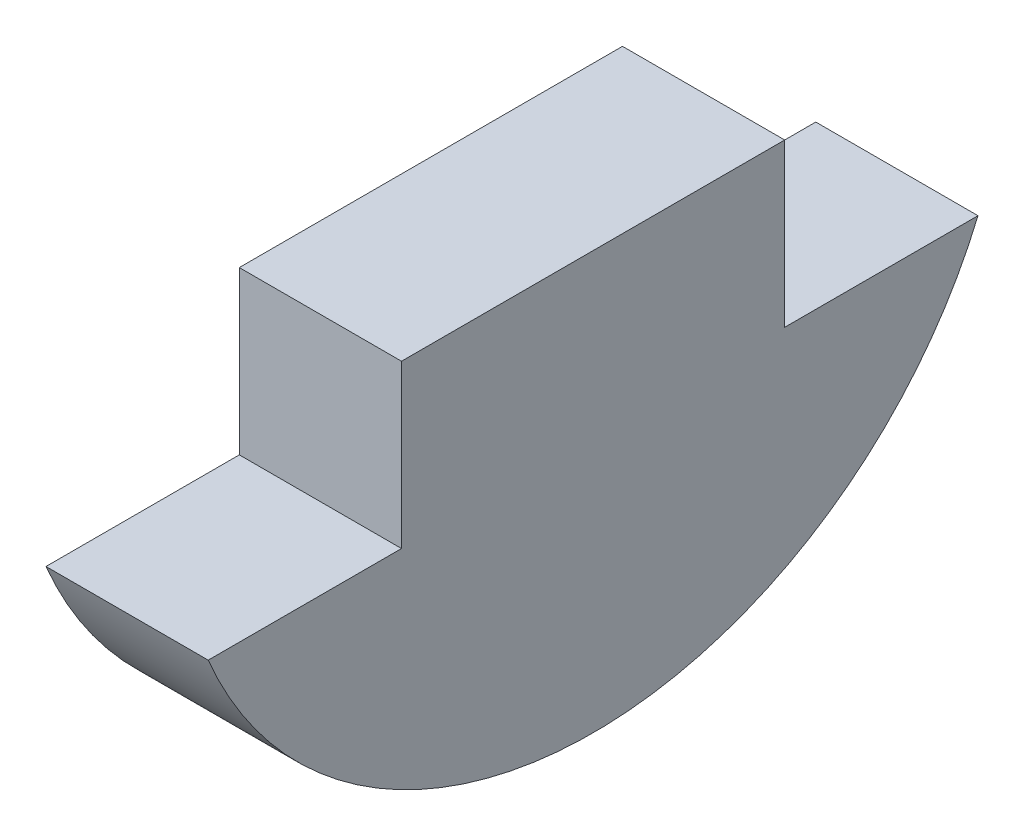
ISO-10303-21;
HEADER;
FILE_DESCRIPTION(('STEP AP214'),'2;1');
FILE_NAME('part.step','',(''),(''),'','','');
FILE_SCHEMA(('AUTOMOTIVE_DESIGN { 1 0 10303 214 1 1 1 1 }'));
ENDSEC;
DATA;
#1=APPLICATION_CONTEXT('core data for automotive mechanical design processes');
#2=APPLICATION_PROTOCOL_DEFINITION('international standard','automotive_design',2000,#1);
#3=PRODUCT_CONTEXT('',#1,'mechanical');
#4=PRODUCT('Part','Part','',(#3));
#5=PRODUCT_RELATED_PRODUCT_CATEGORY('part','',(#4));
#6=PRODUCT_DEFINITION_FORMATION('','',#4);
#7=PRODUCT_DEFINITION_CONTEXT('part definition',#1,'design');
#8=PRODUCT_DEFINITION('design','',#6,#7);
#9=PRODUCT_DEFINITION_SHAPE('','',#8);
#10=(LENGTH_UNIT() NAMED_UNIT(*) SI_UNIT(.MILLI.,.METRE.));
#11=(NAMED_UNIT(*) PLANE_ANGLE_UNIT() SI_UNIT($,.RADIAN.));
#12=(NAMED_UNIT(*) SI_UNIT($,.STERADIAN.) SOLID_ANGLE_UNIT());
#13=UNCERTAINTY_MEASURE_WITH_UNIT(LENGTH_MEASURE(1.E-05),#10,'distance_accuracy_value','');
#14=(GEOMETRIC_REPRESENTATION_CONTEXT(3) GLOBAL_UNCERTAINTY_ASSIGNED_CONTEXT((#13)) GLOBAL_UNIT_ASSIGNED_CONTEXT((#10,
#11,#12)) REPRESENTATION_CONTEXT('',''));
#15=CARTESIAN_POINT('',(0.,0.,0.));
#16=DIRECTION('',(0.,0.,1.));
#17=DIRECTION('',(1.,0.,0.));
#18=AXIS2_PLACEMENT_3D('',#15,#16,#17);
#19=CARTESIAN_POINT('',(2.54,0.,3.));
#20=DIRECTION('',(0.,0.,-1.));
#21=DIRECTION('',(0.,1.,0.));
#22=AXIS2_PLACEMENT_3D('',#19,#20,#21);
#23=PLANE('',#22);
#24=DIRECTION('',(0.,-1.,0.));
#25=VECTOR('',#24,1.);
#26=CARTESIAN_POINT('',(0.,0.,3.));
#27=LINE('',#26,#25);
#28=CARTESIAN_POINT('',(0.,0.,3.));
#29=VERTEX_POINT('',#28);
#30=CARTESIAN_POINT('',(0.,-2.54,3.));
#31=VERTEX_POINT('',#30);
#32=EDGE_CURVE('E114',#29,#31,#27,.T.);
#33=ORIENTED_EDGE('',*,*,#32,.T.);
#34=DIRECTION('',(-1.,0.,0.));
#35=VECTOR('',#34,1.);
#36=CARTESIAN_POINT('',(2.54,-2.54,3.));
#37=LINE('',#36,#35);
#38=CARTESIAN_POINT('',(2.54,-2.54,3.));
#39=VERTEX_POINT('',#38);
#40=EDGE_CURVE('E11',#39,#31,#37,.T.);
#41=ORIENTED_EDGE('',*,*,#40,.F.);
#42=DIRECTION('',(0.,-1.,0.));
#43=VECTOR('',#42,1.);
#44=CARTESIAN_POINT('',(2.54,0.,3.));
#45=LINE('',#44,#43);
#46=CARTESIAN_POINT('',(2.54,0.,3.));
#47=VERTEX_POINT('',#46);
#48=EDGE_CURVE('E124',#47,#39,#45,.T.);
#49=ORIENTED_EDGE('',*,*,#48,.F.);
#50=DIRECTION('',(-1.,0.,0.));
#51=VECTOR('',#50,1.);
#52=CARTESIAN_POINT('',(2.54,0.,3.));
#53=LINE('',#52,#51);
#54=EDGE_CURVE('E110',#47,#29,#53,.T.);
#55=ORIENTED_EDGE('',*,*,#54,.T.);
#56=EDGE_LOOP('',(#33,#41,#49,#55));
#57=FACE_BOUND('',#56,.T.);
#58=ADVANCED_FACE('F30',(#57),#23,.F.);
#59=CARTESIAN_POINT('',(2.54,-2.54,3.));
#60=DIRECTION('',(0.,-1.,0.));
#61=DIRECTION('',(0.,0.,-1.));
#62=AXIS2_PLACEMENT_3D('',#59,#60,#61);
#63=PLANE('',#62);
#64=DIRECTION('',(0.,0.,1.));
#65=VECTOR('',#64,1.);
#66=CARTESIAN_POINT('',(0.,-2.54,3.));
#67=LINE('',#66,#65);
#68=CARTESIAN_POINT('',(0.,-2.54,6.02660766932774));
#69=VERTEX_POINT('',#68);
#70=EDGE_CURVE('E117',#31,#69,#67,.T.);
#71=ORIENTED_EDGE('',*,*,#70,.T.);
#72=DIRECTION('',(-1.,0.,0.));
#73=VECTOR('',#72,1.);
#74=CARTESIAN_POINT('',(2.54,-2.54,6.02660766932774));
#75=LINE('',#74,#73);
#76=CARTESIAN_POINT('',(2.54,-2.54,6.02660766932774));
#77=VERTEX_POINT('',#76);
#78=EDGE_CURVE('E38',#77,#69,#75,.T.);
#79=ORIENTED_EDGE('',*,*,#78,.F.);
#80=DIRECTION('',(0.,0.,1.));
#81=VECTOR('',#80,1.);
#82=CARTESIAN_POINT('',(2.54,-2.54,3.));
#83=LINE('',#82,#81);
#84=EDGE_CURVE('E83',#39,#77,#83,.T.);
#85=ORIENTED_EDGE('',*,*,#84,.F.);
#86=ORIENTED_EDGE('',*,*,#40,.T.);
#87=EDGE_LOOP('',(#71,#79,#85,#86));
#88=FACE_BOUND('',#87,.T.);
#89=ADVANCED_FACE('F148',(#88),#63,.F.);
#90=CARTESIAN_POINT('',(2.54,0.,0.));
#91=DIRECTION('',(-1.,0.,0.));
#92=DIRECTION('',(0.,0.,1.));
#93=AXIS2_PLACEMENT_3D('',#90,#91,#92);
#94=CYLINDRICAL_SURFACE('',#93,6.54);
#95=CARTESIAN_POINT('',(0.,0.,0.));
#96=DIRECTION('',(1.,0.,0.));
#97=DIRECTION('',(0.,0.,-1.));
#98=AXIS2_PLACEMENT_3D('',#95,#96,#97);
#99=CIRCLE('',#98,6.54);
#100=CARTESIAN_POINT('',(0.,-2.54,-6.02660766932774));
#101=VERTEX_POINT('',#100);
#102=EDGE_CURVE('E119',#69,#101,#99,.T.);
#103=ORIENTED_EDGE('',*,*,#102,.T.);
#104=DIRECTION('',(-1.,0.,0.));
#105=VECTOR('',#104,1.);
#106=CARTESIAN_POINT('',(2.54,-2.54,-6.02660766932774));
#107=LINE('',#106,#105);
#108=CARTESIAN_POINT('',(2.54,-2.54,-6.02660766932774));
#109=VERTEX_POINT('',#108);
#110=EDGE_CURVE('E105',#109,#101,#107,.T.);
#111=ORIENTED_EDGE('',*,*,#110,.F.);
#112=CARTESIAN_POINT('',(2.54,0.,0.));
#113=DIRECTION('',(1.,0.,0.));
#114=DIRECTION('',(0.,0.,-1.));
#115=AXIS2_PLACEMENT_3D('',#112,#113,#114);
#116=CIRCLE('',#115,6.54);
#117=EDGE_CURVE('E96',#77,#109,#116,.T.);
#118=ORIENTED_EDGE('',*,*,#117,.F.);
#119=ORIENTED_EDGE('',*,*,#78,.T.);
#120=EDGE_LOOP('',(#103,#111,#118,#119));
#121=FACE_BOUND('',#120,.T.);
#122=ADVANCED_FACE('F130',(#121),#94,.T.);
#123=CARTESIAN_POINT('',(2.54,-2.54,-3.));
#124=DIRECTION('',(0.,-1.,0.));
#125=DIRECTION('',(0.,0.,-1.));
#126=AXIS2_PLACEMENT_3D('',#123,#124,#125);
#127=PLANE('',#126);
#128=DIRECTION('',(0.,0.,1.));
#129=VECTOR('',#128,1.);
#130=CARTESIAN_POINT('',(0.,-2.54,-3.));
#131=LINE('',#130,#129);
#132=CARTESIAN_POINT('',(0.,-2.54,-3.));
#133=VERTEX_POINT('',#132);
#134=EDGE_CURVE('E104',#101,#133,#131,.T.);
#135=ORIENTED_EDGE('',*,*,#134,.T.);
#136=DIRECTION('',(-1.,0.,0.));
#137=VECTOR('',#136,1.);
#138=CARTESIAN_POINT('',(2.54,-2.54,-3.));
#139=LINE('',#138,#137);
#140=CARTESIAN_POINT('',(2.54,-2.54,-3.));
#141=VERTEX_POINT('',#140);
#142=EDGE_CURVE('E101',#141,#133,#139,.T.);
#143=ORIENTED_EDGE('',*,*,#142,.F.);
#144=DIRECTION('',(0.,0.,1.));
#145=VECTOR('',#144,1.);
#146=CARTESIAN_POINT('',(2.54,-2.54,-3.));
#147=LINE('',#146,#145);
#148=EDGE_CURVE('E90',#109,#141,#147,.T.);
#149=ORIENTED_EDGE('',*,*,#148,.F.);
#150=ORIENTED_EDGE('',*,*,#110,.T.);
#151=EDGE_LOOP('',(#135,#143,#149,#150));
#152=FACE_BOUND('',#151,.T.);
#153=ADVANCED_FACE('F102',(#152),#127,.F.);
#154=CARTESIAN_POINT('',(2.54,0.,-3.));
#155=DIRECTION('',(0.,0.,1.));
#156=DIRECTION('',(0.,-1.,0.));
#157=AXIS2_PLACEMENT_3D('',#154,#155,#156);
#158=PLANE('',#157);
#159=DIRECTION('',(0.,1.,0.));
#160=VECTOR('',#159,1.);
#161=CARTESIAN_POINT('',(0.,0.,-3.));
#162=LINE('',#161,#160);
#163=CARTESIAN_POINT('',(0.,0.,-3.));
#164=VERTEX_POINT('',#163);
#165=EDGE_CURVE('E69',#133,#164,#162,.T.);
#166=ORIENTED_EDGE('',*,*,#165,.T.);
#167=DIRECTION('',(-1.,0.,0.));
#168=VECTOR('',#167,1.);
#169=CARTESIAN_POINT('',(2.54,0.,-3.));
#170=LINE('',#169,#168);
#171=CARTESIAN_POINT('',(2.54,0.,-3.));
#172=VERTEX_POINT('',#171);
#173=EDGE_CURVE('E106',#172,#164,#170,.T.);
#174=ORIENTED_EDGE('',*,*,#173,.F.);
#175=DIRECTION('',(0.,1.,0.));
#176=VECTOR('',#175,1.);
#177=CARTESIAN_POINT('',(2.54,0.,-3.));
#178=LINE('',#177,#176);
#179=EDGE_CURVE('E94',#141,#172,#178,.T.);
#180=ORIENTED_EDGE('',*,*,#179,.F.);
#181=ORIENTED_EDGE('',*,*,#142,.T.);
#182=EDGE_LOOP('',(#166,#174,#180,#181));
#183=FACE_BOUND('',#182,.T.);
#184=ADVANCED_FACE('F108',(#183),#158,.F.);
#185=CARTESIAN_POINT('',(2.54,0.,3.));
#186=DIRECTION('',(0.,-1.,0.));
#187=DIRECTION('',(0.,0.,-1.));
#188=AXIS2_PLACEMENT_3D('',#185,#186,#187);
#189=PLANE('',#188);
#190=DIRECTION('',(0.,0.,1.));
#191=VECTOR('',#190,1.);
#192=CARTESIAN_POINT('',(0.,0.,3.));
#193=LINE('',#192,#191);
#194=EDGE_CURVE('E75',#164,#29,#193,.T.);
#195=ORIENTED_EDGE('',*,*,#194,.T.);
#196=ORIENTED_EDGE('',*,*,#54,.F.);
#197=DIRECTION('',(0.,0.,1.));
#198=VECTOR('',#197,1.);
#199=CARTESIAN_POINT('',(2.54,0.,3.));
#200=LINE('',#199,#198);
#201=EDGE_CURVE('E46',#172,#47,#200,.T.);
#202=ORIENTED_EDGE('',*,*,#201,.F.);
#203=ORIENTED_EDGE('',*,*,#173,.T.);
#204=EDGE_LOOP('',(#195,#196,#202,#203));
#205=FACE_BOUND('',#204,.T.);
#206=ADVANCED_FACE('F137',(#205),#189,.F.);
#207=CARTESIAN_POINT('',(2.54,0.,0.));
#208=DIRECTION('',(1.,0.,0.));
#209=DIRECTION('',(0.,0.,-1.));
#210=AXIS2_PLACEMENT_3D('',#207,#208,#209);
#211=PLANE('',#210);
#212=ORIENTED_EDGE('',*,*,#48,.T.);
#213=ORIENTED_EDGE('',*,*,#84,.T.);
#214=ORIENTED_EDGE('',*,*,#117,.T.);
#215=ORIENTED_EDGE('',*,*,#148,.T.);
#216=ORIENTED_EDGE('',*,*,#179,.T.);
#217=ORIENTED_EDGE('',*,*,#201,.T.);
#218=EDGE_LOOP('',(#212,#213,#214,#215,#216,#217));
#219=FACE_BOUND('',#218,.T.);
#220=ADVANCED_FACE('F92',(#219),#211,.T.);
#221=CARTESIAN_POINT('',(0.,0.,0.));
#222=DIRECTION('',(1.,0.,0.));
#223=DIRECTION('',(0.,0.,-1.));
#224=AXIS2_PLACEMENT_3D('',#221,#222,#223);
#225=PLANE('',#224);
#226=ORIENTED_EDGE('',*,*,#32,.F.);
#227=ORIENTED_EDGE('',*,*,#194,.F.);
#228=ORIENTED_EDGE('',*,*,#165,.F.);
#229=ORIENTED_EDGE('',*,*,#134,.F.);
#230=ORIENTED_EDGE('',*,*,#102,.F.);
#231=ORIENTED_EDGE('',*,*,#70,.F.);
#232=EDGE_LOOP('',(#226,#227,#228,#229,#230,#231));
#233=FACE_BOUND('',#232,.T.);
#234=ADVANCED_FACE('F133',(#233),#225,.F.);
#235=CLOSED_SHELL('',(#58,#89,#122,#153,#184,#206,#220,#234));
#236=MANIFOLD_SOLID_BREP('B2',#235);
#237=ADVANCED_BREP_SHAPE_REPRESENTATION('',(#18,#236),#14);
#238=SHAPE_DEFINITION_REPRESENTATION(#9,#237);
ENDSEC;
END-ISO-10303-21;
